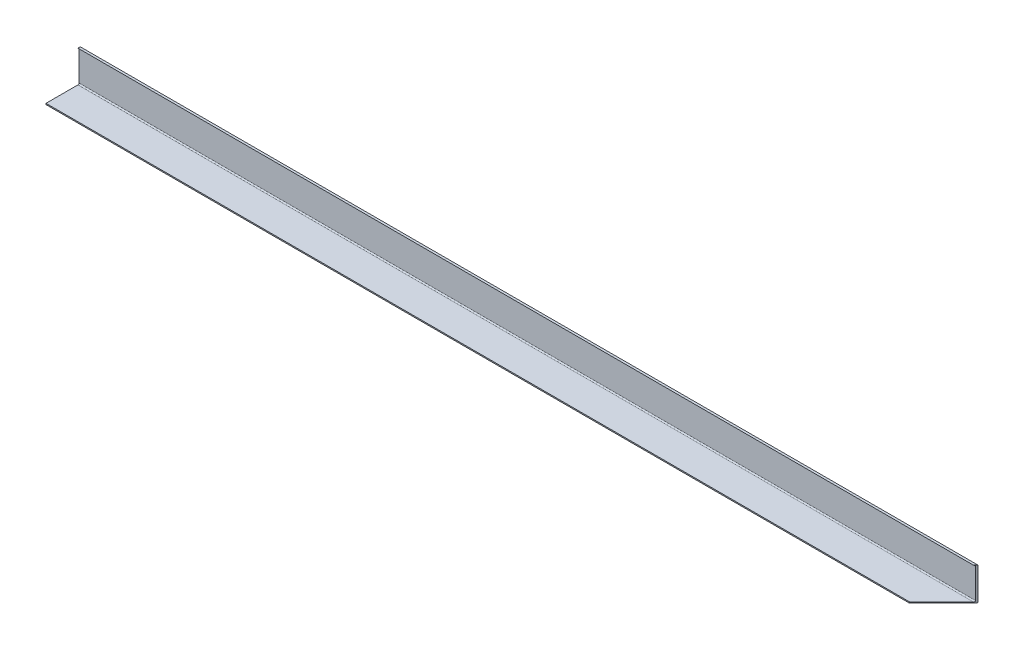
ISO-10303-21;
HEADER;
FILE_DESCRIPTION(('STEP AP214'),'2;1');
FILE_NAME('part.step','',(''),(''),'','','');
FILE_SCHEMA(('AUTOMOTIVE_DESIGN { 1 0 10303 214 1 1 1 1 }'));
ENDSEC;
DATA;
#1=APPLICATION_CONTEXT('core data for automotive mechanical design processes');
#2=APPLICATION_PROTOCOL_DEFINITION('international standard','automotive_design',2000,#1);
#3=PRODUCT_CONTEXT('',#1,'mechanical');
#4=PRODUCT('Part','Part','',(#3));
#5=PRODUCT_RELATED_PRODUCT_CATEGORY('part','',(#4));
#6=PRODUCT_DEFINITION_FORMATION('','',#4);
#7=PRODUCT_DEFINITION_CONTEXT('part definition',#1,'design');
#8=PRODUCT_DEFINITION('design','',#6,#7);
#9=PRODUCT_DEFINITION_SHAPE('','',#8);
#10=(LENGTH_UNIT() NAMED_UNIT(*) SI_UNIT(.MILLI.,.METRE.));
#11=(NAMED_UNIT(*) PLANE_ANGLE_UNIT() SI_UNIT($,.RADIAN.));
#12=(NAMED_UNIT(*) SI_UNIT($,.STERADIAN.) SOLID_ANGLE_UNIT());
#13=UNCERTAINTY_MEASURE_WITH_UNIT(LENGTH_MEASURE(1.E-05),#10,'distance_accuracy_value','');
#14=(GEOMETRIC_REPRESENTATION_CONTEXT(3) GLOBAL_UNCERTAINTY_ASSIGNED_CONTEXT((#13)) GLOBAL_UNIT_ASSIGNED_CONTEXT((#10,
#11,#12)) REPRESENTATION_CONTEXT('',''));
#15=CARTESIAN_POINT('',(0.,0.,0.));
#16=DIRECTION('',(0.,0.,1.));
#17=DIRECTION('',(1.,0.,0.));
#18=AXIS2_PLACEMENT_3D('',#15,#16,#17);
#19=CARTESIAN_POINT('',(2310.,0.,0.));
#20=DIRECTION('',(0.,0.,-1.));
#21=DIRECTION('',(-1.,0.,0.));
#22=AXIS2_PLACEMENT_3D('',#19,#20,#21);
#23=PLANE('',#22);
#24=DIRECTION('',(-1.,0.,0.));
#25=VECTOR('',#24,1.);
#26=CARTESIAN_POINT('',(2310.,-3.,0.));
#27=LINE('',#26,#25);
#28=CARTESIAN_POINT('',(2222.,-3.,0.));
#29=VERTEX_POINT('',#28);
#30=CARTESIAN_POINT('',(0.,-3.,0.));
#31=VERTEX_POINT('',#30);
#32=EDGE_CURVE('E114',#29,#31,#27,.T.);
#33=ORIENTED_EDGE('',*,*,#32,.F.);
#34=DIRECTION('',(0.,1.,0.));
#35=VECTOR('',#34,1.);
#36=CARTESIAN_POINT('',(2222.,-3.,0.));
#37=LINE('',#36,#35);
#38=CARTESIAN_POINT('',(2222.,0.,0.));
#39=VERTEX_POINT('',#38);
#40=EDGE_CURVE('E181',#29,#39,#37,.T.);
#41=ORIENTED_EDGE('',*,*,#40,.T.);
#42=DIRECTION('',(-1.,0.,0.));
#43=VECTOR('',#42,1.);
#44=CARTESIAN_POINT('',(2310.,0.,0.));
#45=LINE('',#44,#43);
#46=CARTESIAN_POINT('',(0.,0.,0.));
#47=VERTEX_POINT('',#46);
#48=EDGE_CURVE('E138',#39,#47,#45,.T.);
#49=ORIENTED_EDGE('',*,*,#48,.T.);
#50=DIRECTION('',(0.,-1.,0.));
#51=VECTOR('',#50,1.);
#52=CARTESIAN_POINT('',(0.,0.,0.));
#53=LINE('',#52,#51);
#54=EDGE_CURVE('E131',#47,#31,#53,.T.);
#55=ORIENTED_EDGE('',*,*,#54,.T.);
#56=EDGE_LOOP('',(#33,#41,#49,#55));
#57=FACE_BOUND('',#56,.T.);
#58=ADVANCED_FACE('F33',(#57),#23,.F.);
#59=CARTESIAN_POINT('',(2310.,-3.,0.));
#60=DIRECTION('',(0.,1.,0.));
#61=DIRECTION('',(0.,0.,1.));
#62=AXIS2_PLACEMENT_3D('',#59,#60,#61);
#63=PLANE('',#62);
#64=DIRECTION('',(-1.,0.,0.));
#65=VECTOR('',#64,1.);
#66=CARTESIAN_POINT('',(2310.,-3.,-85.));
#67=LINE('',#66,#65);
#68=CARTESIAN_POINT('',(0.,-3.,-85.));
#69=VERTEX_POINT('',#68);
#70=CARTESIAN_POINT('',(2307.,-3.,-85.));
#71=VERTEX_POINT('',#70);
#72=EDGE_CURVE('E143',#69,#71,#67,.F.);
#73=ORIENTED_EDGE('',*,*,#72,.T.);
#74=DIRECTION('',(-0.707106781186544,0.,0.707106781186551));
#75=VECTOR('',#74,1.);
#76=CARTESIAN_POINT('',(2310.,-3.,-88.));
#77=LINE('',#76,#75);
#78=EDGE_CURVE('E121',#71,#29,#77,.T.);
#79=ORIENTED_EDGE('',*,*,#78,.T.);
#80=ORIENTED_EDGE('',*,*,#32,.T.);
#81=DIRECTION('',(0.,0.,-1.));
#82=VECTOR('',#81,1.);
#83=CARTESIAN_POINT('',(0.,-3.,0.));
#84=LINE('',#83,#82);
#85=EDGE_CURVE('E127',#31,#69,#84,.T.);
#86=ORIENTED_EDGE('',*,*,#85,.T.);
#87=EDGE_LOOP('',(#73,#79,#80,#86));
#88=FACE_BOUND('',#87,.T.);
#89=ADVANCED_FACE('F186',(#88),#63,.F.);
#90=CARTESIAN_POINT('',(2310.,-3.,-88.));
#91=DIRECTION('',(0.,0.,1.));
#92=DIRECTION('',(1.,0.,0.));
#93=AXIS2_PLACEMENT_3D('',#90,#91,#92);
#94=PLANE('',#93);
#95=DIRECTION('',(0.,1.,0.));
#96=VECTOR('',#95,1.);
#97=CARTESIAN_POINT('',(2310.,-3.,-88.));
#98=LINE('',#97,#96);
#99=CARTESIAN_POINT('',(2310.,0.,-88.));
#100=VERTEX_POINT('',#99);
#101=CARTESIAN_POINT('',(2310.,82.,-88.));
#102=VERTEX_POINT('',#101);
#103=EDGE_CURVE('E137',#100,#102,#98,.T.);
#104=ORIENTED_EDGE('',*,*,#103,.F.);
#105=DIRECTION('',(-1.,0.,0.));
#106=VECTOR('',#105,1.);
#107=CARTESIAN_POINT('',(2310.,0.,-88.));
#108=LINE('',#107,#106);
#109=CARTESIAN_POINT('',(0.,0.,-88.));
#110=VERTEX_POINT('',#109);
#111=EDGE_CURVE('E113',#100,#110,#108,.T.);
#112=ORIENTED_EDGE('',*,*,#111,.T.);
#113=DIRECTION('',(0.,1.,0.));
#114=VECTOR('',#113,1.);
#115=CARTESIAN_POINT('',(0.,-3.,-88.));
#116=LINE('',#115,#114);
#117=CARTESIAN_POINT('',(0.,82.,-88.));
#118=VERTEX_POINT('',#117);
#119=EDGE_CURVE('E117',#110,#118,#116,.T.);
#120=ORIENTED_EDGE('',*,*,#119,.T.);
#121=DIRECTION('',(-1.,0.,0.));
#122=VECTOR('',#121,1.);
#123=CARTESIAN_POINT('',(2310.,82.,-88.));
#124=LINE('',#123,#122);
#125=EDGE_CURVE('E104',#118,#102,#124,.F.);
#126=ORIENTED_EDGE('',*,*,#125,.T.);
#127=EDGE_LOOP('',(#104,#112,#120,#126));
#128=FACE_BOUND('',#127,.T.);
#129=ADVANCED_FACE('F124',(#128),#94,.F.);
#130=CARTESIAN_POINT('',(2310.,0.,-85.));
#131=DIRECTION('',(0.,0.,-1.));
#132=DIRECTION('',(-1.,0.,0.));
#133=AXIS2_PLACEMENT_3D('',#130,#131,#132);
#134=PLANE('',#133);
#135=DIRECTION('',(-1.,0.,0.));
#136=VECTOR('',#135,1.);
#137=CARTESIAN_POINT('',(2310.,3.,-85.));
#138=LINE('',#137,#136);
#139=CARTESIAN_POINT('',(0.,3.,-85.));
#140=VERTEX_POINT('',#139);
#141=CARTESIAN_POINT('',(2307.,3.,-85.));
#142=VERTEX_POINT('',#141);
#143=EDGE_CURVE('E146',#140,#142,#138,.F.);
#144=ORIENTED_EDGE('',*,*,#143,.T.);
#145=DIRECTION('',(0.,1.,0.));
#146=VECTOR('',#145,1.);
#147=CARTESIAN_POINT('',(2307.,0.,-85.));
#148=LINE('',#147,#146);
#149=CARTESIAN_POINT('',(2307.,79.,-85.));
#150=VERTEX_POINT('',#149);
#151=EDGE_CURVE('E175',#142,#150,#148,.T.);
#152=ORIENTED_EDGE('',*,*,#151,.T.);
#153=DIRECTION('',(-1.,0.,0.));
#154=VECTOR('',#153,1.);
#155=CARTESIAN_POINT('',(0.,79.,-85.));
#156=LINE('',#155,#154);
#157=CARTESIAN_POINT('',(0.,79.,-85.));
#158=VERTEX_POINT('',#157);
#159=EDGE_CURVE('E149',#150,#158,#156,.T.);
#160=ORIENTED_EDGE('',*,*,#159,.T.);
#161=DIRECTION('',(0.,-1.,0.));
#162=VECTOR('',#161,1.);
#163=CARTESIAN_POINT('',(0.,0.,-85.));
#164=LINE('',#163,#162);
#165=EDGE_CURVE('E126',#158,#140,#164,.T.);
#166=ORIENTED_EDGE('',*,*,#165,.T.);
#167=EDGE_LOOP('',(#144,#152,#160,#166));
#168=FACE_BOUND('',#167,.T.);
#169=ADVANCED_FACE('F192',(#168),#134,.F.);
#170=CARTESIAN_POINT('',(2310.,0.,0.));
#171=DIRECTION('',(0.,-1.,0.));
#172=DIRECTION('',(0.,0.,-1.));
#173=AXIS2_PLACEMENT_3D('',#170,#171,#172);
#174=PLANE('',#173);
#175=ORIENTED_EDGE('',*,*,#48,.F.);
#176=DIRECTION('',(0.707106781186544,0.,-0.707106781186551));
#177=VECTOR('',#176,1.);
#178=CARTESIAN_POINT('',(2266.,0.,-43.9999999999996));
#179=LINE('',#178,#177);
#180=CARTESIAN_POINT('',(2304.,0.,-82.));
#181=VERTEX_POINT('',#180);
#182=EDGE_CURVE('E161',#39,#181,#179,.T.);
#183=ORIENTED_EDGE('',*,*,#182,.T.);
#184=DIRECTION('',(-1.,0.,0.));
#185=VECTOR('',#184,1.);
#186=CARTESIAN_POINT('',(0.,0.,-82.));
#187=LINE('',#186,#185);
#188=CARTESIAN_POINT('',(0.,0.,-82.));
#189=VERTEX_POINT('',#188);
#190=EDGE_CURVE('E153',#181,#189,#187,.T.);
#191=ORIENTED_EDGE('',*,*,#190,.T.);
#192=DIRECTION('',(0.,0.,1.));
#193=VECTOR('',#192,1.);
#194=CARTESIAN_POINT('',(0.,0.,0.));
#195=LINE('',#194,#193);
#196=EDGE_CURVE('E129',#189,#47,#195,.T.);
#197=ORIENTED_EDGE('',*,*,#196,.T.);
#198=EDGE_LOOP('',(#175,#183,#191,#197));
#199=FACE_BOUND('',#198,.T.);
#200=ADVANCED_FACE('F159',(#199),#174,.F.);
#201=CARTESIAN_POINT('',(0.,0.,0.));
#202=DIRECTION('',(1.,0.,0.));
#203=DIRECTION('',(0.,0.,-1.));
#204=AXIS2_PLACEMENT_3D('',#201,#202,#203);
#205=PLANE('',#204);
#206=CARTESIAN_POINT('',(0.,79.,-82.));
#207=DIRECTION('',(1.,0.,0.));
#208=DIRECTION('',(0.,0.,-1.));
#209=AXIS2_PLACEMENT_3D('',#206,#207,#208);
#210=CIRCLE('',#209,3.);
#211=CARTESIAN_POINT('',(0.,82.,-82.));
#212=VERTEX_POINT('',#211);
#213=EDGE_CURVE('E119',#158,#212,#210,.T.);
#214=ORIENTED_EDGE('',*,*,#213,.T.);
#215=DIRECTION('',(0.,0.,1.));
#216=VECTOR('',#215,1.);
#217=CARTESIAN_POINT('',(0.,82.,-88.));
#218=LINE('',#217,#216);
#219=EDGE_CURVE('E107',#118,#212,#218,.T.);
#220=ORIENTED_EDGE('',*,*,#219,.F.);
#221=ORIENTED_EDGE('',*,*,#119,.F.);
#222=CARTESIAN_POINT('',(0.,0.,-85.));
#223=DIRECTION('',(1.,0.,0.));
#224=DIRECTION('',(0.,0.,-1.));
#225=AXIS2_PLACEMENT_3D('',#222,#223,#224);
#226=CIRCLE('',#225,3.);
#227=EDGE_CURVE('E48',#110,#69,#226,.F.);
#228=ORIENTED_EDGE('',*,*,#227,.T.);
#229=ORIENTED_EDGE('',*,*,#85,.F.);
#230=ORIENTED_EDGE('',*,*,#54,.F.);
#231=ORIENTED_EDGE('',*,*,#196,.F.);
#232=CARTESIAN_POINT('',(0.,3.,-82.));
#233=DIRECTION('',(1.,0.,0.));
#234=DIRECTION('',(0.,0.,-1.));
#235=AXIS2_PLACEMENT_3D('',#232,#233,#234);
#236=CIRCLE('',#235,3.);
#237=EDGE_CURVE('E41',#189,#140,#236,.T.);
#238=ORIENTED_EDGE('',*,*,#237,.T.);
#239=ORIENTED_EDGE('',*,*,#165,.F.);
#240=EDGE_LOOP('',(#214,#220,#221,#228,#229,#230,#231,#238,#239));
#241=FACE_BOUND('',#240,.T.);
#242=ADVANCED_FACE('F116',(#241),#205,.F.);
#243=CARTESIAN_POINT('',(2310.,0.,-85.));
#244=DIRECTION('',(-1.,0.,0.));
#245=DIRECTION('',(0.,0.,1.));
#246=AXIS2_PLACEMENT_3D('',#243,#244,#245);
#247=CYLINDRICAL_SURFACE('',#246,3.);
#248=CARTESIAN_POINT('',(2307.,0.,-85.));
#249=DIRECTION('',(-0.707106781186551,0.,-0.707106781186544));
#250=DIRECTION('',(-0.707106781186544,0.,0.707106781186551));
#251=AXIS2_PLACEMENT_3D('',#248,#249,#250);
#252=ELLIPSE('',#251,4.24264068711927,3.);
#253=EDGE_CURVE('E168',#71,#100,#252,.F.);
#254=ORIENTED_EDGE('',*,*,#253,.F.);
#255=ORIENTED_EDGE('',*,*,#72,.F.);
#256=ORIENTED_EDGE('',*,*,#227,.F.);
#257=ORIENTED_EDGE('',*,*,#111,.F.);
#258=EDGE_LOOP('',(#254,#255,#256,#257));
#259=FACE_BOUND('',#258,.T.);
#260=ADVANCED_FACE('F197',(#259),#247,.T.);
#261=CARTESIAN_POINT('',(2310.,79.,-82.));
#262=DIRECTION('',(1.,0.,0.));
#263=DIRECTION('',(0.,0.,-1.));
#264=AXIS2_PLACEMENT_3D('',#261,#262,#263);
#265=CYLINDRICAL_SURFACE('',#264,3.);
#266=ORIENTED_EDGE('',*,*,#159,.F.);
#267=CARTESIAN_POINT('',(2304.,79.,-82.));
#268=DIRECTION('',(-0.707106781186551,0.,-0.707106781186544));
#269=DIRECTION('',(0.707106781186544,0.,-0.707106781186551));
#270=AXIS2_PLACEMENT_3D('',#267,#268,#269);
#271=ELLIPSE('',#270,4.24264068711927,3.);
#272=CARTESIAN_POINT('',(2304.,82.,-82.));
#273=VERTEX_POINT('',#272);
#274=EDGE_CURVE('E178',#150,#273,#271,.F.);
#275=ORIENTED_EDGE('',*,*,#274,.T.);
#276=DIRECTION('',(-1.,0.,0.));
#277=VECTOR('',#276,1.);
#278=CARTESIAN_POINT('',(2310.,82.,-82.));
#279=LINE('',#278,#277);
#280=EDGE_CURVE('E151',#212,#273,#279,.F.);
#281=ORIENTED_EDGE('',*,*,#280,.F.);
#282=ORIENTED_EDGE('',*,*,#213,.F.);
#283=EDGE_LOOP('',(#266,#275,#281,#282));
#284=FACE_BOUND('',#283,.T.);
#285=ADVANCED_FACE('F195',(#284),#265,.F.);
#286=CARTESIAN_POINT('',(2310.,3.,-82.));
#287=DIRECTION('',(1.,0.,0.));
#288=DIRECTION('',(0.,0.,-1.));
#289=AXIS2_PLACEMENT_3D('',#286,#287,#288);
#290=CYLINDRICAL_SURFACE('',#289,3.);
#291=ORIENTED_EDGE('',*,*,#190,.F.);
#292=CARTESIAN_POINT('',(2304.,3.,-82.));
#293=DIRECTION('',(-0.707106781186551,0.,-0.707106781186544));
#294=DIRECTION('',(0.707106781186544,0.,-0.707106781186551));
#295=AXIS2_PLACEMENT_3D('',#292,#293,#294);
#296=ELLIPSE('',#295,4.24264068711927,3.);
#297=EDGE_CURVE('E173',#181,#142,#296,.F.);
#298=ORIENTED_EDGE('',*,*,#297,.T.);
#299=ORIENTED_EDGE('',*,*,#143,.F.);
#300=ORIENTED_EDGE('',*,*,#237,.F.);
#301=EDGE_LOOP('',(#291,#298,#299,#300));
#302=FACE_BOUND('',#301,.T.);
#303=ADVANCED_FACE('F35',(#302),#290,.F.);
#304=CARTESIAN_POINT('',(2310.,-3.,-88.));
#305=DIRECTION('',(-0.707106781186551,0.,-0.707106781186544));
#306=DIRECTION('',(-0.707106781186544,0.,0.707106781186551));
#307=AXIS2_PLACEMENT_3D('',#304,#305,#306);
#308=PLANE('',#307);
#309=ORIENTED_EDGE('',*,*,#103,.T.);
#310=DIRECTION('',(-0.707106781186544,0.,0.707106781186551));
#311=VECTOR('',#310,1.);
#312=CARTESIAN_POINT('',(2310.,82.,-88.));
#313=LINE('',#312,#311);
#314=EDGE_CURVE('E11',#102,#273,#313,.T.);
#315=ORIENTED_EDGE('',*,*,#314,.T.);
#316=ORIENTED_EDGE('',*,*,#274,.F.);
#317=ORIENTED_EDGE('',*,*,#151,.F.);
#318=ORIENTED_EDGE('',*,*,#297,.F.);
#319=ORIENTED_EDGE('',*,*,#182,.F.);
#320=ORIENTED_EDGE('',*,*,#40,.F.);
#321=ORIENTED_EDGE('',*,*,#78,.F.);
#322=ORIENTED_EDGE('',*,*,#253,.T.);
#323=EDGE_LOOP('',(#309,#315,#316,#317,#318,#319,#320,#321,#322));
#324=FACE_BOUND('',#323,.T.);
#325=ADVANCED_FACE('F190',(#324),#308,.F.);
#326=CARTESIAN_POINT('',(0.,82.,-88.));
#327=DIRECTION('',(0.,-1.,0.));
#328=DIRECTION('',(0.,0.,-1.));
#329=AXIS2_PLACEMENT_3D('',#326,#327,#328);
#330=PLANE('',#329);
#331=ORIENTED_EDGE('',*,*,#314,.F.);
#332=ORIENTED_EDGE('',*,*,#125,.F.);
#333=ORIENTED_EDGE('',*,*,#219,.T.);
#334=ORIENTED_EDGE('',*,*,#280,.T.);
#335=EDGE_LOOP('',(#331,#332,#333,#334));
#336=FACE_BOUND('',#335,.T.);
#337=ADVANCED_FACE('F106',(#336),#330,.F.);
#338=CLOSED_SHELL('',(#58,#89,#129,#169,#200,#242,#260,#285,#303,#325,#337));
#339=MANIFOLD_SOLID_BREP('B2',#338);
#340=ADVANCED_BREP_SHAPE_REPRESENTATION('',(#18,#339),#14);
#341=SHAPE_DEFINITION_REPRESENTATION(#9,#340);
ENDSEC;
END-ISO-10303-21;
